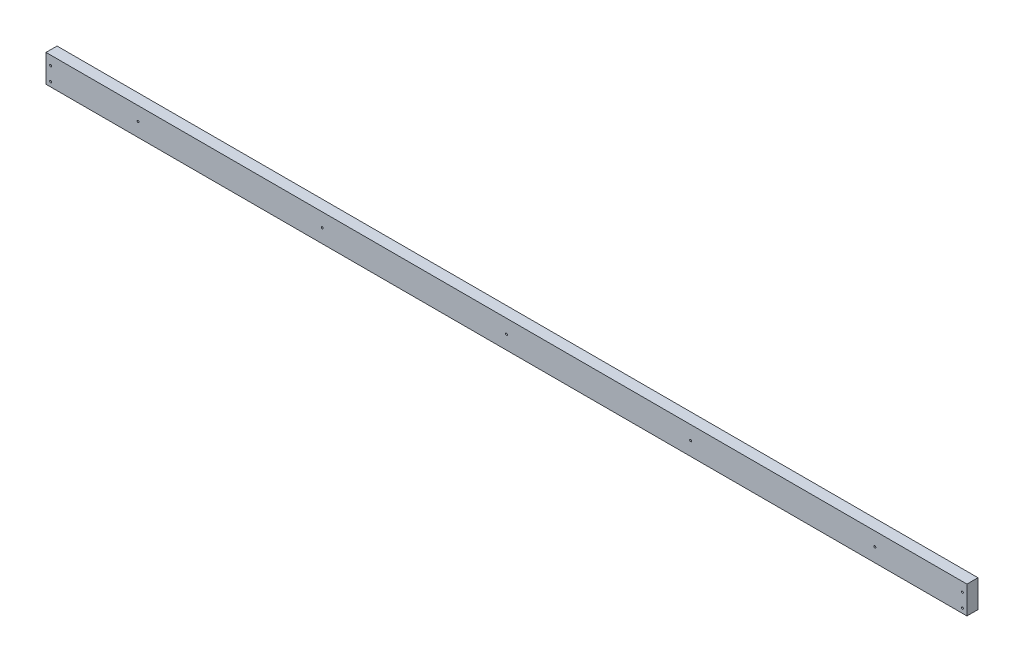
ISO-10303-21;
HEADER;
FILE_DESCRIPTION(('STEP AP214'),'2;1');
FILE_NAME('part.step','',(''),(''),'','','');
FILE_SCHEMA(('AUTOMOTIVE_DESIGN { 1 0 10303 214 1 1 1 1 }'));
ENDSEC;
DATA;
#1=APPLICATION_CONTEXT('core data for automotive mechanical design processes');
#2=APPLICATION_PROTOCOL_DEFINITION('international standard','automotive_design',2000,#1);
#3=PRODUCT_CONTEXT('',#1,'mechanical');
#4=PRODUCT('Part','Part','',(#3));
#5=PRODUCT_RELATED_PRODUCT_CATEGORY('part','',(#4));
#6=PRODUCT_DEFINITION_FORMATION('','',#4);
#7=PRODUCT_DEFINITION_CONTEXT('part definition',#1,'design');
#8=PRODUCT_DEFINITION('design','',#6,#7);
#9=PRODUCT_DEFINITION_SHAPE('','',#8);
#10=(LENGTH_UNIT() NAMED_UNIT(*) SI_UNIT(.MILLI.,.METRE.));
#11=(NAMED_UNIT(*) PLANE_ANGLE_UNIT() SI_UNIT($,.RADIAN.));
#12=(NAMED_UNIT(*) SI_UNIT($,.STERADIAN.) SOLID_ANGLE_UNIT());
#13=UNCERTAINTY_MEASURE_WITH_UNIT(LENGTH_MEASURE(1.E-05),#10,'distance_accuracy_value','');
#14=(GEOMETRIC_REPRESENTATION_CONTEXT(3) GLOBAL_UNCERTAINTY_ASSIGNED_CONTEXT((#13)) GLOBAL_UNIT_ASSIGNED_CONTEXT((#10,
#11,#12)) REPRESENTATION_CONTEXT('',''));
#15=CARTESIAN_POINT('',(0.,0.,0.));
#16=DIRECTION('',(0.,0.,1.));
#17=DIRECTION('',(1.,0.,0.));
#18=AXIS2_PLACEMENT_3D('',#15,#16,#17);
#19=CARTESIAN_POINT('',(0.,75.,30.));
#20=DIRECTION('',(1.,0.,0.));
#21=DIRECTION('',(0.,1.,0.));
#22=AXIS2_PLACEMENT_3D('',#19,#20,#21);
#23=PLANE('',#22);
#24=DIRECTION('',(0.,1.,0.));
#25=VECTOR('',#24,1.);
#26=CARTESIAN_POINT('',(0.,0.,0.));
#27=LINE('',#26,#25);
#28=CARTESIAN_POINT('',(0.,0.,0.));
#29=VERTEX_POINT('',#28);
#30=CARTESIAN_POINT('',(0.,150.,0.));
#31=VERTEX_POINT('',#30);
#32=EDGE_CURVE('E28',#29,#31,#27,.T.);
#33=ORIENTED_EDGE('',*,*,#32,.F.);
#34=DIRECTION('',(0.,0.,-1.));
#35=VECTOR('',#34,1.);
#36=CARTESIAN_POINT('',(0.,0.,60.));
#37=LINE('',#36,#35);
#38=CARTESIAN_POINT('',(0.,0.,60.));
#39=VERTEX_POINT('',#38);
#40=EDGE_CURVE('E190',#39,#29,#37,.T.);
#41=ORIENTED_EDGE('',*,*,#40,.F.);
#42=DIRECTION('',(0.,-1.,0.));
#43=VECTOR('',#42,1.);
#44=CARTESIAN_POINT('',(0.,150.,60.));
#45=LINE('',#44,#43);
#46=CARTESIAN_POINT('',(0.,150.,60.));
#47=VERTEX_POINT('',#46);
#48=EDGE_CURVE('E157',#47,#39,#45,.T.);
#49=ORIENTED_EDGE('',*,*,#48,.F.);
#50=DIRECTION('',(0.,0.,1.));
#51=VECTOR('',#50,1.);
#52=CARTESIAN_POINT('',(0.,150.,0.));
#53=LINE('',#52,#51);
#54=EDGE_CURVE('E206',#31,#47,#53,.T.);
#55=ORIENTED_EDGE('',*,*,#54,.F.);
#56=EDGE_LOOP('',(#33,#41,#49,#55));
#57=FACE_BOUND('',#56,.T.);
#58=ADVANCED_FACE('F17',(#57),#23,.F.);
#59=CARTESIAN_POINT('',(5000.,75.,30.));
#60=DIRECTION('',(1.,0.,0.));
#61=DIRECTION('',(0.,1.,0.));
#62=AXIS2_PLACEMENT_3D('',#59,#60,#61);
#63=PLANE('',#62);
#64=DIRECTION('',(0.,1.,0.));
#65=VECTOR('',#64,1.);
#66=CARTESIAN_POINT('',(5000.,0.,0.));
#67=LINE('',#66,#65);
#68=CARTESIAN_POINT('',(5000.,0.,0.));
#69=VERTEX_POINT('',#68);
#70=CARTESIAN_POINT('',(5000.,150.,0.));
#71=VERTEX_POINT('',#70);
#72=EDGE_CURVE('E11',#69,#71,#67,.T.);
#73=ORIENTED_EDGE('',*,*,#72,.T.);
#74=DIRECTION('',(0.,0.,1.));
#75=VECTOR('',#74,1.);
#76=CARTESIAN_POINT('',(5000.,150.,0.));
#77=LINE('',#76,#75);
#78=CARTESIAN_POINT('',(5000.,150.,60.));
#79=VERTEX_POINT('',#78);
#80=EDGE_CURVE('E209',#71,#79,#77,.T.);
#81=ORIENTED_EDGE('',*,*,#80,.T.);
#82=DIRECTION('',(0.,-1.,0.));
#83=VECTOR('',#82,1.);
#84=CARTESIAN_POINT('',(5000.,150.,60.));
#85=LINE('',#84,#83);
#86=CARTESIAN_POINT('',(5000.,0.,60.));
#87=VERTEX_POINT('',#86);
#88=EDGE_CURVE('E243',#79,#87,#85,.T.);
#89=ORIENTED_EDGE('',*,*,#88,.T.);
#90=DIRECTION('',(0.,0.,-1.));
#91=VECTOR('',#90,1.);
#92=CARTESIAN_POINT('',(5000.,0.,60.));
#93=LINE('',#92,#91);
#94=EDGE_CURVE('E170',#87,#69,#93,.T.);
#95=ORIENTED_EDGE('',*,*,#94,.T.);
#96=EDGE_LOOP('',(#73,#81,#89,#95));
#97=FACE_BOUND('',#96,.T.);
#98=ADVANCED_FACE('F302',(#97),#63,.T.);
#99=CARTESIAN_POINT('',(0.,0.,0.));
#100=DIRECTION('',(0.,0.,-1.));
#101=DIRECTION('',(-1.,0.,0.));
#102=AXIS2_PLACEMENT_3D('',#99,#100,#101);
#103=PLANE('',#102);
#104=CARTESIAN_POINT('',(4975.,24.9999999999978,0.));
#105=DIRECTION('',(0.,0.,1.));
#106=DIRECTION('',(1.,0.,0.));
#107=AXIS2_PLACEMENT_3D('',#104,#105,#106);
#108=CIRCLE('',#107,5.25);
#109=CARTESIAN_POINT('',(4969.75,24.9999999999978,0.));
#110=VERTEX_POINT('',#109);
#111=EDGE_CURVE('E220',#110,#110,#108,.T.);
#112=ORIENTED_EDGE('',*,*,#111,.T.);
#113=EDGE_LOOP('',(#112));
#114=FACE_BOUND('',#113,.T.);
#115=CARTESIAN_POINT('',(4500.,74.9999999999973,0.));
#116=DIRECTION('',(0.,0.,1.));
#117=DIRECTION('',(1.,0.,0.));
#118=AXIS2_PLACEMENT_3D('',#115,#116,#117);
#119=CIRCLE('',#118,5.25);
#120=CARTESIAN_POINT('',(4494.75,74.9999999999973,0.));
#121=VERTEX_POINT('',#120);
#122=EDGE_CURVE('E195',#121,#121,#119,.T.);
#123=ORIENTED_EDGE('',*,*,#122,.T.);
#124=EDGE_LOOP('',(#123));
#125=FACE_BOUND('',#124,.T.);
#126=CARTESIAN_POINT('',(25.,25.,0.));
#127=DIRECTION('',(0.,0.,1.));
#128=DIRECTION('',(1.,0.,0.));
#129=AXIS2_PLACEMENT_3D('',#126,#127,#128);
#130=CIRCLE('',#129,5.25);
#131=CARTESIAN_POINT('',(19.75,25.,0.));
#132=VERTEX_POINT('',#131);
#133=EDGE_CURVE('E165',#132,#132,#130,.T.);
#134=ORIENTED_EDGE('',*,*,#133,.T.);
#135=EDGE_LOOP('',(#134));
#136=FACE_BOUND('',#135,.T.);
#137=CARTESIAN_POINT('',(500.,74.9999999999991,0.));
#138=DIRECTION('',(0.,0.,1.));
#139=DIRECTION('',(1.,0.,0.));
#140=AXIS2_PLACEMENT_3D('',#137,#138,#139);
#141=CIRCLE('',#140,5.25);
#142=CARTESIAN_POINT('',(494.75,74.9999999999991,0.));
#143=VERTEX_POINT('',#142);
#144=EDGE_CURVE('E164',#143,#143,#141,.T.);
#145=ORIENTED_EDGE('',*,*,#144,.T.);
#146=EDGE_LOOP('',(#145));
#147=FACE_BOUND('',#146,.T.);
#148=CARTESIAN_POINT('',(2500.,74.999999999999,0.));
#149=DIRECTION('',(0.,0.,1.));
#150=DIRECTION('',(1.,0.,0.));
#151=AXIS2_PLACEMENT_3D('',#148,#149,#150);
#152=CIRCLE('',#151,5.25);
#153=CARTESIAN_POINT('',(2494.75,74.999999999999,0.));
#154=VERTEX_POINT('',#153);
#155=EDGE_CURVE('E185',#154,#154,#152,.T.);
#156=ORIENTED_EDGE('',*,*,#155,.T.);
#157=EDGE_LOOP('',(#156));
#158=FACE_BOUND('',#157,.T.);
#159=CARTESIAN_POINT('',(1500.,74.999999999999,0.));
#160=DIRECTION('',(0.,0.,1.));
#161=DIRECTION('',(1.,0.,0.));
#162=AXIS2_PLACEMENT_3D('',#159,#160,#161);
#163=CIRCLE('',#162,5.25);
#164=CARTESIAN_POINT('',(1494.75,74.999999999999,0.));
#165=VERTEX_POINT('',#164);
#166=EDGE_CURVE('E141',#165,#165,#163,.T.);
#167=ORIENTED_EDGE('',*,*,#166,.T.);
#168=EDGE_LOOP('',(#167));
#169=FACE_BOUND('',#168,.T.);
#170=CARTESIAN_POINT('',(25.,100.,0.));
#171=DIRECTION('',(0.,0.,1.));
#172=DIRECTION('',(1.,0.,0.));
#173=AXIS2_PLACEMENT_3D('',#170,#171,#172);
#174=CIRCLE('',#173,5.25);
#175=CARTESIAN_POINT('',(19.75,100.,0.));
#176=VERTEX_POINT('',#175);
#177=EDGE_CURVE('E253',#176,#176,#174,.T.);
#178=ORIENTED_EDGE('',*,*,#177,.T.);
#179=EDGE_LOOP('',(#178));
#180=FACE_BOUND('',#179,.T.);
#181=CARTESIAN_POINT('',(3500.,74.9999999999982,0.));
#182=DIRECTION('',(0.,0.,1.));
#183=DIRECTION('',(1.,0.,0.));
#184=AXIS2_PLACEMENT_3D('',#181,#182,#183);
#185=CIRCLE('',#184,5.25);
#186=CARTESIAN_POINT('',(3494.75,74.9999999999982,0.));
#187=VERTEX_POINT('',#186);
#188=EDGE_CURVE('E179',#187,#187,#185,.T.);
#189=ORIENTED_EDGE('',*,*,#188,.T.);
#190=EDGE_LOOP('',(#189));
#191=FACE_BOUND('',#190,.T.);
#192=CARTESIAN_POINT('',(4975.,99.9999999999979,0.));
#193=DIRECTION('',(0.,0.,1.));
#194=DIRECTION('',(1.,0.,0.));
#195=AXIS2_PLACEMENT_3D('',#192,#193,#194);
#196=CIRCLE('',#195,5.25);
#197=CARTESIAN_POINT('',(4969.75,99.9999999999979,0.));
#198=VERTEX_POINT('',#197);
#199=EDGE_CURVE('E236',#198,#198,#196,.T.);
#200=ORIENTED_EDGE('',*,*,#199,.T.);
#201=EDGE_LOOP('',(#200));
#202=FACE_BOUND('',#201,.T.);
#203=ORIENTED_EDGE('',*,*,#32,.T.);
#204=DIRECTION('',(1.,0.,0.));
#205=VECTOR('',#204,1.);
#206=CARTESIAN_POINT('',(0.,150.,0.));
#207=LINE('',#206,#205);
#208=EDGE_CURVE('E232',#31,#71,#207,.T.);
#209=ORIENTED_EDGE('',*,*,#208,.T.);
#210=ORIENTED_EDGE('',*,*,#72,.F.);
#211=DIRECTION('',(1.,0.,0.));
#212=VECTOR('',#211,1.);
#213=CARTESIAN_POINT('',(0.,0.,0.));
#214=LINE('',#213,#212);
#215=EDGE_CURVE('E174',#29,#69,#214,.T.);
#216=ORIENTED_EDGE('',*,*,#215,.F.);
#217=EDGE_LOOP('',(#203,#209,#210,#216));
#218=FACE_BOUND('',#217,.T.);
#219=ADVANCED_FACE('F146',(#114,#125,#136,#147,#158,#169,#180,#191,#202,#218),#103,.T.);
#220=CARTESIAN_POINT('',(0.,150.,0.));
#221=DIRECTION('',(0.,1.,0.));
#222=DIRECTION('',(1.,0.,0.));
#223=AXIS2_PLACEMENT_3D('',#220,#221,#222);
#224=PLANE('',#223);
#225=ORIENTED_EDGE('',*,*,#54,.T.);
#226=DIRECTION('',(1.,0.,0.));
#227=VECTOR('',#226,1.);
#228=CARTESIAN_POINT('',(0.,150.,60.));
#229=LINE('',#228,#227);
#230=EDGE_CURVE('E210',#47,#79,#229,.T.);
#231=ORIENTED_EDGE('',*,*,#230,.T.);
#232=ORIENTED_EDGE('',*,*,#80,.F.);
#233=ORIENTED_EDGE('',*,*,#208,.F.);
#234=EDGE_LOOP('',(#225,#231,#232,#233));
#235=FACE_BOUND('',#234,.T.);
#236=ADVANCED_FACE('F301',(#235),#224,.T.);
#237=CARTESIAN_POINT('',(0.,150.,60.));
#238=DIRECTION('',(0.,0.,1.));
#239=DIRECTION('',(1.,0.,0.));
#240=AXIS2_PLACEMENT_3D('',#237,#238,#239);
#241=PLANE('',#240);
#242=CARTESIAN_POINT('',(4975.,24.9999999999978,60.));
#243=DIRECTION('',(0.,0.,-1.));
#244=DIRECTION('',(1.,0.,0.));
#245=AXIS2_PLACEMENT_3D('',#242,#243,#244);
#246=CIRCLE('',#245,5.25);
#247=CARTESIAN_POINT('',(4969.75,24.9999999999978,60.));
#248=VERTEX_POINT('',#247);
#249=EDGE_CURVE('E194',#248,#248,#246,.T.);
#250=ORIENTED_EDGE('',*,*,#249,.T.);
#251=EDGE_LOOP('',(#250));
#252=FACE_BOUND('',#251,.T.);
#253=CARTESIAN_POINT('',(4500.,74.9999999999973,60.));
#254=DIRECTION('',(0.,0.,-1.));
#255=DIRECTION('',(1.,0.,0.));
#256=AXIS2_PLACEMENT_3D('',#253,#254,#255);
#257=CIRCLE('',#256,5.25);
#258=CARTESIAN_POINT('',(4494.75,74.9999999999973,60.));
#259=VERTEX_POINT('',#258);
#260=EDGE_CURVE('E219',#259,#259,#257,.T.);
#261=ORIENTED_EDGE('',*,*,#260,.T.);
#262=EDGE_LOOP('',(#261));
#263=FACE_BOUND('',#262,.T.);
#264=CARTESIAN_POINT('',(25.,25.,60.));
#265=DIRECTION('',(0.,0.,-1.));
#266=DIRECTION('',(1.,0.,0.));
#267=AXIS2_PLACEMENT_3D('',#264,#265,#266);
#268=CIRCLE('',#267,5.25);
#269=CARTESIAN_POINT('',(19.75,25.,60.));
#270=VERTEX_POINT('',#269);
#271=EDGE_CURVE('E200',#270,#270,#268,.T.);
#272=ORIENTED_EDGE('',*,*,#271,.T.);
#273=EDGE_LOOP('',(#272));
#274=FACE_BOUND('',#273,.T.);
#275=CARTESIAN_POINT('',(500.,74.9999999999991,60.));
#276=DIRECTION('',(0.,0.,-1.));
#277=DIRECTION('',(1.,0.,0.));
#278=AXIS2_PLACEMENT_3D('',#275,#276,#277);
#279=CIRCLE('',#278,5.25);
#280=CARTESIAN_POINT('',(494.75,74.9999999999991,60.));
#281=VERTEX_POINT('',#280);
#282=EDGE_CURVE('E163',#281,#281,#279,.T.);
#283=ORIENTED_EDGE('',*,*,#282,.T.);
#284=EDGE_LOOP('',(#283));
#285=FACE_BOUND('',#284,.T.);
#286=CARTESIAN_POINT('',(2500.,74.999999999999,60.));
#287=DIRECTION('',(0.,0.,-1.));
#288=DIRECTION('',(1.,0.,0.));
#289=AXIS2_PLACEMENT_3D('',#286,#287,#288);
#290=CIRCLE('',#289,5.25);
#291=CARTESIAN_POINT('',(2494.75,74.999999999999,60.));
#292=VERTEX_POINT('',#291);
#293=EDGE_CURVE('E178',#292,#292,#290,.T.);
#294=ORIENTED_EDGE('',*,*,#293,.T.);
#295=EDGE_LOOP('',(#294));
#296=FACE_BOUND('',#295,.T.);
#297=CARTESIAN_POINT('',(1500.,74.999999999999,60.));
#298=DIRECTION('',(0.,0.,-1.));
#299=DIRECTION('',(1.,0.,0.));
#300=AXIS2_PLACEMENT_3D('',#297,#298,#299);
#301=CIRCLE('',#300,5.25);
#302=CARTESIAN_POINT('',(1494.75,74.999999999999,60.));
#303=VERTEX_POINT('',#302);
#304=EDGE_CURVE('E142',#303,#303,#301,.T.);
#305=ORIENTED_EDGE('',*,*,#304,.T.);
#306=EDGE_LOOP('',(#305));
#307=FACE_BOUND('',#306,.T.);
#308=CARTESIAN_POINT('',(25.,100.,60.));
#309=DIRECTION('',(0.,0.,-1.));
#310=DIRECTION('',(1.,0.,0.));
#311=AXIS2_PLACEMENT_3D('',#308,#309,#310);
#312=CIRCLE('',#311,5.25);
#313=CARTESIAN_POINT('',(19.75,100.,60.));
#314=VERTEX_POINT('',#313);
#315=EDGE_CURVE('E21',#314,#314,#312,.T.);
#316=ORIENTED_EDGE('',*,*,#315,.T.);
#317=EDGE_LOOP('',(#316));
#318=FACE_BOUND('',#317,.T.);
#319=CARTESIAN_POINT('',(3500.,74.9999999999982,60.));
#320=DIRECTION('',(0.,0.,-1.));
#321=DIRECTION('',(1.,0.,0.));
#322=AXIS2_PLACEMENT_3D('',#319,#320,#321);
#323=CIRCLE('',#322,5.25);
#324=CARTESIAN_POINT('',(3494.75,74.9999999999982,60.));
#325=VERTEX_POINT('',#324);
#326=EDGE_CURVE('E256',#325,#325,#323,.T.);
#327=ORIENTED_EDGE('',*,*,#326,.T.);
#328=EDGE_LOOP('',(#327));
#329=FACE_BOUND('',#328,.T.);
#330=CARTESIAN_POINT('',(4975.,99.9999999999979,60.));
#331=DIRECTION('',(0.,0.,-1.));
#332=DIRECTION('',(1.,0.,0.));
#333=AXIS2_PLACEMENT_3D('',#330,#331,#332);
#334=CIRCLE('',#333,5.25);
#335=CARTESIAN_POINT('',(4969.75,99.9999999999979,60.));
#336=VERTEX_POINT('',#335);
#337=EDGE_CURVE('E184',#336,#336,#334,.T.);
#338=ORIENTED_EDGE('',*,*,#337,.T.);
#339=EDGE_LOOP('',(#338));
#340=FACE_BOUND('',#339,.T.);
#341=ORIENTED_EDGE('',*,*,#48,.T.);
#342=DIRECTION('',(1.,0.,0.));
#343=VECTOR('',#342,1.);
#344=CARTESIAN_POINT('',(0.,0.,60.));
#345=LINE('',#344,#343);
#346=EDGE_CURVE('E173',#39,#87,#345,.T.);
#347=ORIENTED_EDGE('',*,*,#346,.T.);
#348=ORIENTED_EDGE('',*,*,#88,.F.);
#349=ORIENTED_EDGE('',*,*,#230,.F.);
#350=EDGE_LOOP('',(#341,#347,#348,#349));
#351=FACE_BOUND('',#350,.T.);
#352=ADVANCED_FACE('F294',(#252,#263,#274,#285,#296,#307,#318,#329,#340,#351),#241,.T.);
#353=CARTESIAN_POINT('',(0.,0.,60.));
#354=DIRECTION('',(0.,-1.,0.));
#355=DIRECTION('',(0.,0.,-1.));
#356=AXIS2_PLACEMENT_3D('',#353,#354,#355);
#357=PLANE('',#356);
#358=ORIENTED_EDGE('',*,*,#40,.T.);
#359=ORIENTED_EDGE('',*,*,#215,.T.);
#360=ORIENTED_EDGE('',*,*,#94,.F.);
#361=ORIENTED_EDGE('',*,*,#346,.F.);
#362=EDGE_LOOP('',(#358,#359,#360,#361));
#363=FACE_BOUND('',#362,.T.);
#364=ADVANCED_FACE('F316',(#363),#357,.T.);
#365=CARTESIAN_POINT('',(4975.,24.9999999999978,0.));
#366=DIRECTION('',(0.,0.,1.));
#367=DIRECTION('',(1.,0.,0.));
#368=AXIS2_PLACEMENT_3D('',#365,#366,#367);
#369=CYLINDRICAL_SURFACE('',#368,5.25);
#370=ORIENTED_EDGE('',*,*,#111,.F.);
#371=DIRECTION('',(0.,0.,1.));
#372=VECTOR('',#371,1.);
#373=CARTESIAN_POINT('',(4969.75,24.9999999999978,0.));
#374=LINE('',#373,#372);
#375=EDGE_CURVE('E224',#110,#248,#374,.T.);
#376=ORIENTED_EDGE('',*,*,#375,.T.);
#377=ORIENTED_EDGE('',*,*,#249,.F.);
#378=ORIENTED_EDGE('',*,*,#375,.F.);
#379=EDGE_LOOP('',(#370,#376,#377,#378));
#380=FACE_BOUND('',#379,.T.);
#381=ADVANCED_FACE('F513',(#380),#369,.F.);
#382=CARTESIAN_POINT('',(4500.,74.9999999999973,0.));
#383=DIRECTION('',(0.,0.,1.));
#384=DIRECTION('',(1.,0.,0.));
#385=AXIS2_PLACEMENT_3D('',#382,#383,#384);
#386=CYLINDRICAL_SURFACE('',#385,5.25);
#387=ORIENTED_EDGE('',*,*,#122,.F.);
#388=DIRECTION('',(0.,0.,1.));
#389=VECTOR('',#388,1.);
#390=CARTESIAN_POINT('',(4494.75,74.9999999999973,0.));
#391=LINE('',#390,#389);
#392=EDGE_CURVE('E199',#121,#259,#391,.T.);
#393=ORIENTED_EDGE('',*,*,#392,.T.);
#394=ORIENTED_EDGE('',*,*,#260,.F.);
#395=ORIENTED_EDGE('',*,*,#392,.F.);
#396=EDGE_LOOP('',(#387,#393,#394,#395));
#397=FACE_BOUND('',#396,.T.);
#398=ADVANCED_FACE('F19',(#397),#386,.F.);
#399=CARTESIAN_POINT('',(25.,25.,0.));
#400=DIRECTION('',(0.,0.,1.));
#401=DIRECTION('',(1.,0.,0.));
#402=AXIS2_PLACEMENT_3D('',#399,#400,#401);
#403=CYLINDRICAL_SURFACE('',#402,5.25);
#404=ORIENTED_EDGE('',*,*,#133,.F.);
#405=DIRECTION('',(0.,0.,1.));
#406=VECTOR('',#405,1.);
#407=CARTESIAN_POINT('',(19.75,25.,0.));
#408=LINE('',#407,#406);
#409=EDGE_CURVE('E169',#132,#270,#408,.T.);
#410=ORIENTED_EDGE('',*,*,#409,.T.);
#411=ORIENTED_EDGE('',*,*,#271,.F.);
#412=ORIENTED_EDGE('',*,*,#409,.F.);
#413=EDGE_LOOP('',(#404,#410,#411,#412));
#414=FACE_BOUND('',#413,.T.);
#415=ADVANCED_FACE('F493',(#414),#403,.F.);
#416=CARTESIAN_POINT('',(500.,74.9999999999991,0.));
#417=DIRECTION('',(0.,0.,1.));
#418=DIRECTION('',(1.,0.,0.));
#419=AXIS2_PLACEMENT_3D('',#416,#417,#418);
#420=CYLINDRICAL_SURFACE('',#419,5.25);
#421=ORIENTED_EDGE('',*,*,#144,.F.);
#422=DIRECTION('',(0.,0.,1.));
#423=VECTOR('',#422,1.);
#424=CARTESIAN_POINT('',(494.75,74.9999999999991,0.));
#425=LINE('',#424,#423);
#426=EDGE_CURVE('E159',#143,#281,#425,.T.);
#427=ORIENTED_EDGE('',*,*,#426,.T.);
#428=ORIENTED_EDGE('',*,*,#282,.F.);
#429=ORIENTED_EDGE('',*,*,#426,.F.);
#430=EDGE_LOOP('',(#421,#427,#428,#429));
#431=FACE_BOUND('',#430,.T.);
#432=ADVANCED_FACE('F484',(#431),#420,.F.);
#433=CARTESIAN_POINT('',(2500.,74.999999999999,0.));
#434=DIRECTION('',(0.,0.,1.));
#435=DIRECTION('',(1.,0.,0.));
#436=AXIS2_PLACEMENT_3D('',#433,#434,#435);
#437=CYLINDRICAL_SURFACE('',#436,5.25);
#438=ORIENTED_EDGE('',*,*,#155,.F.);
#439=DIRECTION('',(0.,0.,1.));
#440=VECTOR('',#439,1.);
#441=CARTESIAN_POINT('',(2494.75,74.999999999999,0.));
#442=LINE('',#441,#440);
#443=EDGE_CURVE('E189',#154,#292,#442,.T.);
#444=ORIENTED_EDGE('',*,*,#443,.T.);
#445=ORIENTED_EDGE('',*,*,#293,.F.);
#446=ORIENTED_EDGE('',*,*,#443,.F.);
#447=EDGE_LOOP('',(#438,#444,#445,#446));
#448=FACE_BOUND('',#447,.T.);
#449=ADVANCED_FACE('F311',(#448),#437,.F.);
#450=CARTESIAN_POINT('',(1500.,74.999999999999,0.));
#451=DIRECTION('',(0.,0.,1.));
#452=DIRECTION('',(1.,0.,0.));
#453=AXIS2_PLACEMENT_3D('',#450,#451,#452);
#454=CYLINDRICAL_SURFACE('',#453,5.25);
#455=ORIENTED_EDGE('',*,*,#166,.F.);
#456=DIRECTION('',(0.,0.,1.));
#457=VECTOR('',#456,1.);
#458=CARTESIAN_POINT('',(1494.75,74.999999999999,0.));
#459=LINE('',#458,#457);
#460=EDGE_CURVE('E138',#165,#303,#459,.T.);
#461=ORIENTED_EDGE('',*,*,#460,.T.);
#462=ORIENTED_EDGE('',*,*,#304,.F.);
#463=ORIENTED_EDGE('',*,*,#460,.F.);
#464=EDGE_LOOP('',(#455,#461,#462,#463));
#465=FACE_BOUND('',#464,.T.);
#466=ADVANCED_FACE('F140',(#465),#454,.F.);
#467=CARTESIAN_POINT('',(25.,100.,0.));
#468=DIRECTION('',(0.,0.,1.));
#469=DIRECTION('',(1.,0.,0.));
#470=AXIS2_PLACEMENT_3D('',#467,#468,#469);
#471=CYLINDRICAL_SURFACE('',#470,5.25);
#472=ORIENTED_EDGE('',*,*,#177,.F.);
#473=DIRECTION('',(0.,0.,1.));
#474=VECTOR('',#473,1.);
#475=CARTESIAN_POINT('',(19.75,100.,0.));
#476=LINE('',#475,#474);
#477=EDGE_CURVE('E154',#176,#314,#476,.T.);
#478=ORIENTED_EDGE('',*,*,#477,.T.);
#479=ORIENTED_EDGE('',*,*,#315,.F.);
#480=ORIENTED_EDGE('',*,*,#477,.F.);
#481=EDGE_LOOP('',(#472,#478,#479,#480));
#482=FACE_BOUND('',#481,.T.);
#483=ADVANCED_FACE('F452',(#482),#471,.F.);
#484=CARTESIAN_POINT('',(3500.,74.9999999999982,0.));
#485=DIRECTION('',(0.,0.,1.));
#486=DIRECTION('',(1.,0.,0.));
#487=AXIS2_PLACEMENT_3D('',#484,#485,#486);
#488=CYLINDRICAL_SURFACE('',#487,5.25);
#489=ORIENTED_EDGE('',*,*,#188,.F.);
#490=DIRECTION('',(0.,0.,1.));
#491=VECTOR('',#490,1.);
#492=CARTESIAN_POINT('',(3494.75,74.9999999999982,0.));
#493=LINE('',#492,#491);
#494=EDGE_CURVE('E183',#187,#325,#493,.T.);
#495=ORIENTED_EDGE('',*,*,#494,.T.);
#496=ORIENTED_EDGE('',*,*,#326,.F.);
#497=ORIENTED_EDGE('',*,*,#494,.F.);
#498=EDGE_LOOP('',(#489,#495,#496,#497));
#499=FACE_BOUND('',#498,.T.);
#500=ADVANCED_FACE('F438',(#499),#488,.F.);
#501=CARTESIAN_POINT('',(4975.,99.9999999999979,0.));
#502=DIRECTION('',(0.,0.,1.));
#503=DIRECTION('',(1.,0.,0.));
#504=AXIS2_PLACEMENT_3D('',#501,#502,#503);
#505=CYLINDRICAL_SURFACE('',#504,5.25);
#506=ORIENTED_EDGE('',*,*,#199,.F.);
#507=DIRECTION('',(0.,0.,1.));
#508=VECTOR('',#507,1.);
#509=CARTESIAN_POINT('',(4969.75,99.9999999999979,0.));
#510=LINE('',#509,#508);
#511=EDGE_CURVE('E205',#198,#336,#510,.T.);
#512=ORIENTED_EDGE('',*,*,#511,.T.);
#513=ORIENTED_EDGE('',*,*,#337,.F.);
#514=ORIENTED_EDGE('',*,*,#511,.F.);
#515=EDGE_LOOP('',(#506,#512,#513,#514));
#516=FACE_BOUND('',#515,.T.);
#517=ADVANCED_FACE('F432',(#516),#505,.F.);
#518=CLOSED_SHELL('',(#58,#98,#219,#236,#352,#364,#381,#398,#415,#432,#449,#466,#483,#500,#517));
#519=MANIFOLD_SOLID_BREP('B1',#518);
#520=ADVANCED_BREP_SHAPE_REPRESENTATION('',(#18,#519),#14);
#521=SHAPE_DEFINITION_REPRESENTATION(#9,#520);
ENDSEC;
END-ISO-10303-21;
